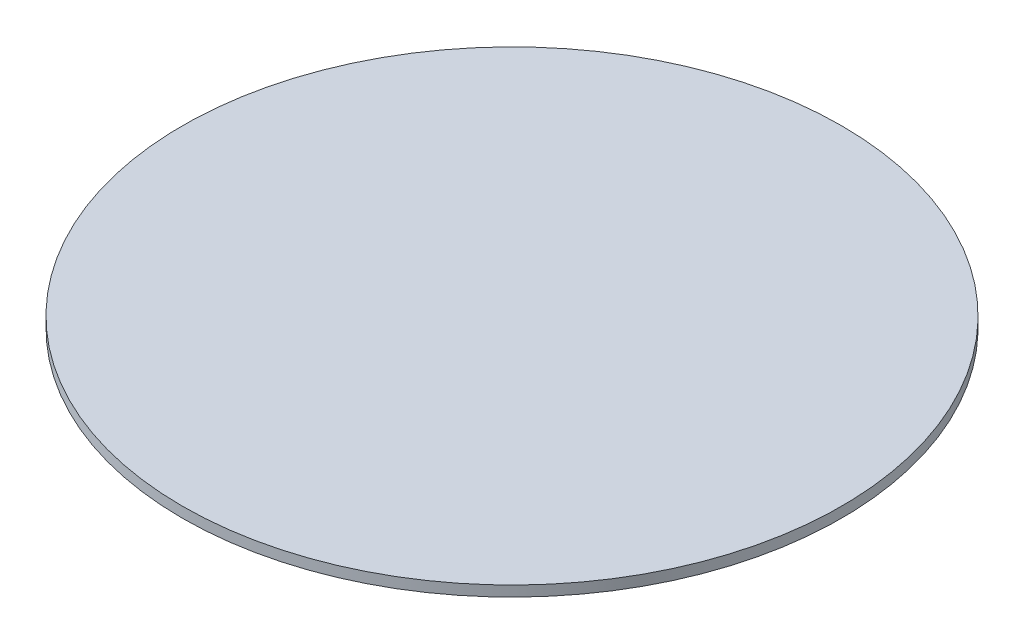
ISO-10303-21;
HEADER;
FILE_DESCRIPTION(('STEP AP214'),'2;1');
FILE_NAME('part.step','',(''),(''),'','','');
FILE_SCHEMA(('AUTOMOTIVE_DESIGN { 1 0 10303 214 1 1 1 1 }'));
ENDSEC;
DATA;
#1=APPLICATION_CONTEXT('core data for automotive mechanical design processes');
#2=APPLICATION_PROTOCOL_DEFINITION('international standard','automotive_design',2000,#1);
#3=PRODUCT_CONTEXT('',#1,'mechanical');
#4=PRODUCT('Part','Part','',(#3));
#5=PRODUCT_RELATED_PRODUCT_CATEGORY('part','',(#4));
#6=PRODUCT_DEFINITION_FORMATION('','',#4);
#7=PRODUCT_DEFINITION_CONTEXT('part definition',#1,'design');
#8=PRODUCT_DEFINITION('design','',#6,#7);
#9=PRODUCT_DEFINITION_SHAPE('','',#8);
#10=(LENGTH_UNIT() NAMED_UNIT(*) SI_UNIT(.MILLI.,.METRE.));
#11=(NAMED_UNIT(*) PLANE_ANGLE_UNIT() SI_UNIT($,.RADIAN.));
#12=(NAMED_UNIT(*) SI_UNIT($,.STERADIAN.) SOLID_ANGLE_UNIT());
#13=UNCERTAINTY_MEASURE_WITH_UNIT(LENGTH_MEASURE(1.E-05),#10,'distance_accuracy_value','');
#14=(GEOMETRIC_REPRESENTATION_CONTEXT(3) GLOBAL_UNCERTAINTY_ASSIGNED_CONTEXT((#13)) GLOBAL_UNIT_ASSIGNED_CONTEXT((#10,
#11,#12)) REPRESENTATION_CONTEXT('',''));
#15=CARTESIAN_POINT('',(0.,0.,0.));
#16=DIRECTION('',(0.,0.,1.));
#17=DIRECTION('',(1.,0.,0.));
#18=AXIS2_PLACEMENT_3D('',#15,#16,#17);
#19=CARTESIAN_POINT('',(0.,3.175,0.));
#20=DIRECTION('',(0.,-1.,0.));
#21=DIRECTION('',(0.,0.,-1.));
#22=AXIS2_PLACEMENT_3D('',#19,#20,#21);
#23=CYLINDRICAL_SURFACE('',#22,100.);
#24=CARTESIAN_POINT('',(0.,3.175,0.));
#25=DIRECTION('',(0.,1.,0.));
#26=DIRECTION('',(0.,0.,1.));
#27=AXIS2_PLACEMENT_3D('',#24,#25,#26);
#28=CIRCLE('',#27,100.);
#29=CARTESIAN_POINT('',(0.,3.175,100.));
#30=VERTEX_POINT('',#29);
#31=EDGE_CURVE('E10',#30,#30,#28,.T.);
#32=ORIENTED_EDGE('',*,*,#31,.F.);
#33=EDGE_LOOP('',(#32));
#34=FACE_BOUND('',#33,.T.);
#35=CARTESIAN_POINT('',(0.,0.,0.));
#36=DIRECTION('',(0.,1.,0.));
#37=DIRECTION('',(0.,0.,1.));
#38=AXIS2_PLACEMENT_3D('',#35,#36,#37);
#39=CIRCLE('',#38,100.);
#40=CARTESIAN_POINT('',(0.,0.,100.));
#41=VERTEX_POINT('',#40);
#42=EDGE_CURVE('E34',#41,#41,#39,.T.);
#43=ORIENTED_EDGE('',*,*,#42,.T.);
#44=EDGE_LOOP('',(#43));
#45=FACE_BOUND('',#44,.T.);
#46=ADVANCED_FACE('F31',(#34,#45),#23,.T.);
#47=CARTESIAN_POINT('',(0.,3.175,0.));
#48=DIRECTION('',(0.,1.,0.));
#49=DIRECTION('',(0.,0.,1.));
#50=AXIS2_PLACEMENT_3D('',#47,#48,#49);
#51=PLANE('',#50);
#52=ORIENTED_EDGE('',*,*,#31,.T.);
#53=EDGE_LOOP('',(#52));
#54=FACE_BOUND('',#53,.T.);
#55=ADVANCED_FACE('F46',(#54),#51,.T.);
#56=CARTESIAN_POINT('',(0.,0.,0.));
#57=DIRECTION('',(0.,1.,0.));
#58=DIRECTION('',(0.,0.,1.));
#59=AXIS2_PLACEMENT_3D('',#56,#57,#58);
#60=PLANE('',#59);
#61=ORIENTED_EDGE('',*,*,#42,.F.);
#62=EDGE_LOOP('',(#61));
#63=FACE_BOUND('',#62,.T.);
#64=ADVANCED_FACE('F44',(#63),#60,.F.);
#65=CLOSED_SHELL('',(#46,#55,#64));
#66=MANIFOLD_SOLID_BREP('B2',#65);
#67=ADVANCED_BREP_SHAPE_REPRESENTATION('',(#18,#66),#14);
#68=SHAPE_DEFINITION_REPRESENTATION(#9,#67);
ENDSEC;
END-ISO-10303-21;
